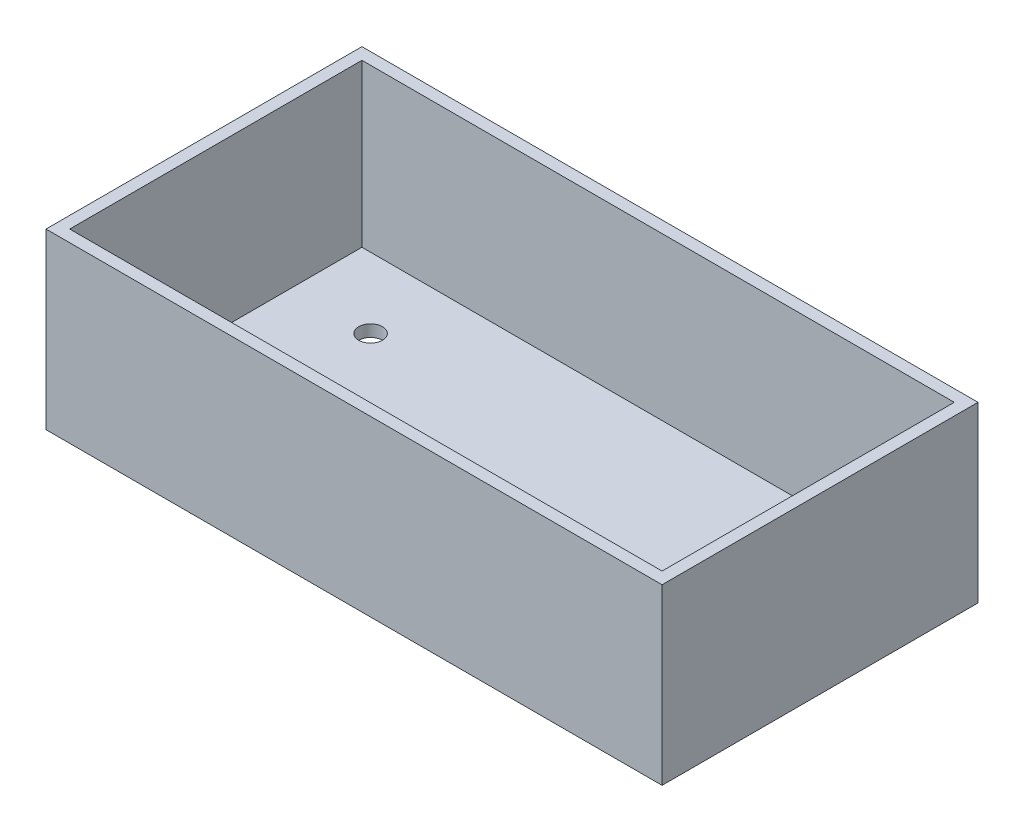
ISO-10303-21;
HEADER;
FILE_DESCRIPTION(('STEP AP214'),'2;1');
FILE_NAME('part.step','',(''),(''),'','','');
FILE_SCHEMA(('AUTOMOTIVE_DESIGN { 1 0 10303 214 1 1 1 1 }'));
ENDSEC;
DATA;
#1=APPLICATION_CONTEXT('core data for automotive mechanical design processes');
#2=APPLICATION_PROTOCOL_DEFINITION('international standard','automotive_design',2000,#1);
#3=PRODUCT_CONTEXT('',#1,'mechanical');
#4=PRODUCT('Part','Part','',(#3));
#5=PRODUCT_RELATED_PRODUCT_CATEGORY('part','',(#4));
#6=PRODUCT_DEFINITION_FORMATION('','',#4);
#7=PRODUCT_DEFINITION_CONTEXT('part definition',#1,'design');
#8=PRODUCT_DEFINITION('design','',#6,#7);
#9=PRODUCT_DEFINITION_SHAPE('','',#8);
#10=(LENGTH_UNIT() NAMED_UNIT(*) SI_UNIT(.MILLI.,.METRE.));
#11=(NAMED_UNIT(*) PLANE_ANGLE_UNIT() SI_UNIT($,.RADIAN.));
#12=(NAMED_UNIT(*) SI_UNIT($,.STERADIAN.) SOLID_ANGLE_UNIT());
#13=UNCERTAINTY_MEASURE_WITH_UNIT(LENGTH_MEASURE(1.E-05),#10,'distance_accuracy_value','');
#14=(GEOMETRIC_REPRESENTATION_CONTEXT(3) GLOBAL_UNCERTAINTY_ASSIGNED_CONTEXT((#13)) GLOBAL_UNIT_ASSIGNED_CONTEXT((#10,
#11,#12)) REPRESENTATION_CONTEXT('',''));
#15=CARTESIAN_POINT('',(0.,0.,0.));
#16=DIRECTION('',(0.,0.,1.));
#17=DIRECTION('',(1.,0.,0.));
#18=AXIS2_PLACEMENT_3D('',#15,#16,#17);
#19=CARTESIAN_POINT('',(0.,22.,0.));
#20=DIRECTION('',(0.,-1.,0.));
#21=DIRECTION('',(0.,0.,-1.));
#22=AXIS2_PLACEMENT_3D('',#19,#20,#21);
#23=PLANE('',#22);
#24=DIRECTION('',(0.,0.,-1.));
#25=VECTOR('',#24,1.);
#26=CARTESIAN_POINT('',(39.,22.,20.));
#27=LINE('',#26,#25);
#28=CARTESIAN_POINT('',(39.,22.,20.));
#29=VERTEX_POINT('',#28);
#30=CARTESIAN_POINT('',(39.,22.,-20.));
#31=VERTEX_POINT('',#30);
#32=EDGE_CURVE('E159',#29,#31,#27,.T.);
#33=ORIENTED_EDGE('',*,*,#32,.T.);
#34=DIRECTION('',(-1.,0.,0.));
#35=VECTOR('',#34,1.);
#36=CARTESIAN_POINT('',(-39.,22.,-20.));
#37=LINE('',#36,#35);
#38=CARTESIAN_POINT('',(-39.,22.,-20.));
#39=VERTEX_POINT('',#38);
#40=EDGE_CURVE('E94',#31,#39,#37,.T.);
#41=ORIENTED_EDGE('',*,*,#40,.T.);
#42=DIRECTION('',(0.,0.,1.));
#43=VECTOR('',#42,1.);
#44=CARTESIAN_POINT('',(-39.,22.,20.));
#45=LINE('',#44,#43);
#46=CARTESIAN_POINT('',(-39.,22.,20.));
#47=VERTEX_POINT('',#46);
#48=EDGE_CURVE('E164',#39,#47,#45,.T.);
#49=ORIENTED_EDGE('',*,*,#48,.T.);
#50=DIRECTION('',(1.,0.,0.));
#51=VECTOR('',#50,1.);
#52=CARTESIAN_POINT('',(-39.,22.,20.));
#53=LINE('',#52,#51);
#54=EDGE_CURVE('E66',#47,#29,#53,.T.);
#55=ORIENTED_EDGE('',*,*,#54,.T.);
#56=EDGE_LOOP('',(#33,#41,#49,#55));
#57=FACE_BOUND('',#56,.T.);
#58=DIRECTION('',(0.,0.,-1.));
#59=VECTOR('',#58,1.);
#60=CARTESIAN_POINT('',(37.5,22.,0.));
#61=LINE('',#60,#59);
#62=CARTESIAN_POINT('',(37.5,22.,18.5));
#63=VERTEX_POINT('',#62);
#64=CARTESIAN_POINT('',(37.5,22.,-18.5));
#65=VERTEX_POINT('',#64);
#66=EDGE_CURVE('E143',#63,#65,#61,.T.);
#67=ORIENTED_EDGE('',*,*,#66,.F.);
#68=DIRECTION('',(1.,0.,0.));
#69=VECTOR('',#68,1.);
#70=CARTESIAN_POINT('',(0.,22.,18.5));
#71=LINE('',#70,#69);
#72=CARTESIAN_POINT('',(-37.5,22.,18.5));
#73=VERTEX_POINT('',#72);
#74=EDGE_CURVE('E156',#73,#63,#71,.T.);
#75=ORIENTED_EDGE('',*,*,#74,.F.);
#76=DIRECTION('',(0.,0.,1.));
#77=VECTOR('',#76,1.);
#78=CARTESIAN_POINT('',(-37.5,22.,0.));
#79=LINE('',#78,#77);
#80=CARTESIAN_POINT('',(-37.5,22.,-18.5));
#81=VERTEX_POINT('',#80);
#82=EDGE_CURVE('E153',#81,#73,#79,.T.);
#83=ORIENTED_EDGE('',*,*,#82,.F.);
#84=DIRECTION('',(-1.,0.,0.));
#85=VECTOR('',#84,1.);
#86=CARTESIAN_POINT('',(0.,22.,-18.5));
#87=LINE('',#86,#85);
#88=EDGE_CURVE('E132',#65,#81,#87,.T.);
#89=ORIENTED_EDGE('',*,*,#88,.F.);
#90=EDGE_LOOP('',(#67,#75,#83,#89));
#91=FACE_BOUND('',#90,.T.);
#92=ADVANCED_FACE('F39',(#57,#91),#23,.F.);
#93=CARTESIAN_POINT('',(39.,22.,20.));
#94=DIRECTION('',(-1.,0.,0.));
#95=DIRECTION('',(0.,0.,1.));
#96=AXIS2_PLACEMENT_3D('',#93,#94,#95);
#97=PLANE('',#96);
#98=DIRECTION('',(0.,0.,-1.));
#99=VECTOR('',#98,1.);
#100=CARTESIAN_POINT('',(39.,0.,20.));
#101=LINE('',#100,#99);
#102=CARTESIAN_POINT('',(39.,0.,20.));
#103=VERTEX_POINT('',#102);
#104=CARTESIAN_POINT('',(39.,0.,-20.));
#105=VERTEX_POINT('',#104);
#106=EDGE_CURVE('E170',#103,#105,#101,.T.);
#107=ORIENTED_EDGE('',*,*,#106,.T.);
#108=DIRECTION('',(0.,-1.,0.));
#109=VECTOR('',#108,1.);
#110=CARTESIAN_POINT('',(39.,22.,-20.));
#111=LINE('',#110,#109);
#112=EDGE_CURVE('E11',#31,#105,#111,.T.);
#113=ORIENTED_EDGE('',*,*,#112,.F.);
#114=ORIENTED_EDGE('',*,*,#32,.F.);
#115=DIRECTION('',(0.,-1.,0.));
#116=VECTOR('',#115,1.);
#117=CARTESIAN_POINT('',(39.,22.,20.));
#118=LINE('',#117,#116);
#119=EDGE_CURVE('E169',#29,#103,#118,.T.);
#120=ORIENTED_EDGE('',*,*,#119,.T.);
#121=EDGE_LOOP('',(#107,#113,#114,#120));
#122=FACE_BOUND('',#121,.T.);
#123=ADVANCED_FACE('F41',(#122),#97,.F.);
#124=CARTESIAN_POINT('',(-39.,22.,-20.));
#125=DIRECTION('',(0.,0.,1.));
#126=DIRECTION('',(1.,0.,0.));
#127=AXIS2_PLACEMENT_3D('',#124,#125,#126);
#128=PLANE('',#127);
#129=DIRECTION('',(-1.,0.,0.));
#130=VECTOR('',#129,1.);
#131=CARTESIAN_POINT('',(-39.,0.,-20.));
#132=LINE('',#131,#130);
#133=CARTESIAN_POINT('',(-39.,0.,-20.));
#134=VERTEX_POINT('',#133);
#135=EDGE_CURVE('E174',#105,#134,#132,.T.);
#136=ORIENTED_EDGE('',*,*,#135,.T.);
#137=DIRECTION('',(0.,-1.,0.));
#138=VECTOR('',#137,1.);
#139=CARTESIAN_POINT('',(-39.,22.,-20.));
#140=LINE('',#139,#138);
#141=EDGE_CURVE('E49',#39,#134,#140,.T.);
#142=ORIENTED_EDGE('',*,*,#141,.F.);
#143=ORIENTED_EDGE('',*,*,#40,.F.);
#144=ORIENTED_EDGE('',*,*,#112,.T.);
#145=EDGE_LOOP('',(#136,#142,#143,#144));
#146=FACE_BOUND('',#145,.T.);
#147=ADVANCED_FACE('F228',(#146),#128,.F.);
#148=CARTESIAN_POINT('',(-39.,22.,20.));
#149=DIRECTION('',(1.,0.,0.));
#150=DIRECTION('',(0.,0.,-1.));
#151=AXIS2_PLACEMENT_3D('',#148,#149,#150);
#152=PLANE('',#151);
#153=DIRECTION('',(0.,0.,1.));
#154=VECTOR('',#153,1.);
#155=CARTESIAN_POINT('',(-39.,0.,20.));
#156=LINE('',#155,#154);
#157=CARTESIAN_POINT('',(-39.,0.,20.));
#158=VERTEX_POINT('',#157);
#159=EDGE_CURVE('E177',#134,#158,#156,.T.);
#160=ORIENTED_EDGE('',*,*,#159,.T.);
#161=DIRECTION('',(0.,-1.,0.));
#162=VECTOR('',#161,1.);
#163=CARTESIAN_POINT('',(-39.,22.,20.));
#164=LINE('',#163,#162);
#165=EDGE_CURVE('E184',#47,#158,#164,.T.);
#166=ORIENTED_EDGE('',*,*,#165,.F.);
#167=ORIENTED_EDGE('',*,*,#48,.F.);
#168=ORIENTED_EDGE('',*,*,#141,.T.);
#169=EDGE_LOOP('',(#160,#166,#167,#168));
#170=FACE_BOUND('',#169,.T.);
#171=ADVANCED_FACE('F240',(#170),#152,.F.);
#172=CARTESIAN_POINT('',(-39.,22.,20.));
#173=DIRECTION('',(0.,0.,-1.));
#174=DIRECTION('',(-1.,0.,0.));
#175=AXIS2_PLACEMENT_3D('',#172,#173,#174);
#176=PLANE('',#175);
#177=DIRECTION('',(1.,0.,0.));
#178=VECTOR('',#177,1.);
#179=CARTESIAN_POINT('',(-39.,0.,20.));
#180=LINE('',#179,#178);
#181=EDGE_CURVE('E87',#158,#103,#180,.T.);
#182=ORIENTED_EDGE('',*,*,#181,.T.);
#183=ORIENTED_EDGE('',*,*,#119,.F.);
#184=ORIENTED_EDGE('',*,*,#54,.F.);
#185=ORIENTED_EDGE('',*,*,#165,.T.);
#186=EDGE_LOOP('',(#182,#183,#184,#185));
#187=FACE_BOUND('',#186,.T.);
#188=ADVANCED_FACE('F236',(#187),#176,.F.);
#189=CARTESIAN_POINT('',(0.,0.,0.));
#190=DIRECTION('',(0.,-1.,0.));
#191=DIRECTION('',(0.,0.,-1.));
#192=AXIS2_PLACEMENT_3D('',#189,#190,#191);
#193=PLANE('',#192);
#194=CARTESIAN_POINT('',(-27.5,0.,9.59999999999999));
#195=DIRECTION('',(0.,-1.,0.));
#196=DIRECTION('',(0.,0.,-1.));
#197=AXIS2_PLACEMENT_3D('',#194,#195,#196);
#198=CIRCLE('',#197,1.5);
#199=CARTESIAN_POINT('',(-27.5,0.,8.09999999999999));
#200=VERTEX_POINT('',#199);
#201=EDGE_CURVE('E366',#200,#200,#198,.T.);
#202=ORIENTED_EDGE('',*,*,#201,.F.);
#203=EDGE_LOOP('',(#202));
#204=FACE_BOUND('',#203,.T.);
#205=CARTESIAN_POINT('',(-27.5,0.,-9.6));
#206=DIRECTION('',(0.,-1.,0.));
#207=DIRECTION('',(0.,0.,-1.));
#208=AXIS2_PLACEMENT_3D('',#205,#206,#207);
#209=CIRCLE('',#208,1.5);
#210=CARTESIAN_POINT('',(-27.5,0.,-11.1));
#211=VERTEX_POINT('',#210);
#212=EDGE_CURVE('E368',#211,#211,#209,.T.);
#213=ORIENTED_EDGE('',*,*,#212,.F.);
#214=EDGE_LOOP('',(#213));
#215=FACE_BOUND('',#214,.T.);
#216=CARTESIAN_POINT('',(27.5,0.,-9.6));
#217=DIRECTION('',(0.,-1.,0.));
#218=DIRECTION('',(0.,0.,-1.));
#219=AXIS2_PLACEMENT_3D('',#216,#217,#218);
#220=CIRCLE('',#219,1.5);
#221=CARTESIAN_POINT('',(27.5,0.,-11.1));
#222=VERTEX_POINT('',#221);
#223=EDGE_CURVE('E371',#222,#222,#220,.T.);
#224=ORIENTED_EDGE('',*,*,#223,.F.);
#225=EDGE_LOOP('',(#224));
#226=FACE_BOUND('',#225,.T.);
#227=CARTESIAN_POINT('',(27.5,0.,9.6));
#228=DIRECTION('',(0.,-1.,0.));
#229=DIRECTION('',(0.,0.,-1.));
#230=AXIS2_PLACEMENT_3D('',#227,#228,#229);
#231=CIRCLE('',#230,1.5);
#232=CARTESIAN_POINT('',(27.5,0.,8.1));
#233=VERTEX_POINT('',#232);
#234=EDGE_CURVE('E195',#233,#233,#231,.T.);
#235=ORIENTED_EDGE('',*,*,#234,.F.);
#236=EDGE_LOOP('',(#235));
#237=FACE_BOUND('',#236,.T.);
#238=ORIENTED_EDGE('',*,*,#106,.F.);
#239=ORIENTED_EDGE('',*,*,#181,.F.);
#240=ORIENTED_EDGE('',*,*,#159,.F.);
#241=ORIENTED_EDGE('',*,*,#135,.F.);
#242=EDGE_LOOP('',(#238,#239,#240,#241));
#243=FACE_BOUND('',#242,.T.);
#244=ADVANCED_FACE('F233',(#204,#215,#226,#237,#243),#193,.T.);
#245=CARTESIAN_POINT('',(37.5,22.,20.));
#246=DIRECTION('',(-1.,0.,0.));
#247=DIRECTION('',(0.,0.,1.));
#248=AXIS2_PLACEMENT_3D('',#245,#246,#247);
#249=PLANE('',#248);
#250=DIRECTION('',(0.,0.,-1.));
#251=VECTOR('',#250,1.);
#252=CARTESIAN_POINT('',(37.5,1.5,0.));
#253=LINE('',#252,#251);
#254=CARTESIAN_POINT('',(37.5,1.5,18.5));
#255=VERTEX_POINT('',#254);
#256=CARTESIAN_POINT('',(37.5,1.5,-18.5));
#257=VERTEX_POINT('',#256);
#258=EDGE_CURVE('E122',#255,#257,#253,.T.);
#259=ORIENTED_EDGE('',*,*,#258,.F.);
#260=DIRECTION('',(0.,-1.,0.));
#261=VECTOR('',#260,1.);
#262=CARTESIAN_POINT('',(37.5,22.,18.5));
#263=LINE('',#262,#261);
#264=EDGE_CURVE('E147',#63,#255,#263,.T.);
#265=ORIENTED_EDGE('',*,*,#264,.F.);
#266=ORIENTED_EDGE('',*,*,#66,.T.);
#267=DIRECTION('',(0.,-1.,0.));
#268=VECTOR('',#267,1.);
#269=CARTESIAN_POINT('',(37.5,22.,-18.5));
#270=LINE('',#269,#268);
#271=EDGE_CURVE('E136',#65,#257,#270,.T.);
#272=ORIENTED_EDGE('',*,*,#271,.T.);
#273=EDGE_LOOP('',(#259,#265,#266,#272));
#274=FACE_BOUND('',#273,.T.);
#275=ADVANCED_FACE('F221',(#274),#249,.T.);
#276=CARTESIAN_POINT('',(-39.,22.,-18.5));
#277=DIRECTION('',(0.,0.,1.));
#278=DIRECTION('',(1.,0.,0.));
#279=AXIS2_PLACEMENT_3D('',#276,#277,#278);
#280=PLANE('',#279);
#281=DIRECTION('',(-1.,0.,0.));
#282=VECTOR('',#281,1.);
#283=CARTESIAN_POINT('',(0.,1.5,-18.5));
#284=LINE('',#283,#282);
#285=CARTESIAN_POINT('',(-37.5,1.5,-18.5));
#286=VERTEX_POINT('',#285);
#287=EDGE_CURVE('E116',#257,#286,#284,.T.);
#288=ORIENTED_EDGE('',*,*,#287,.F.);
#289=ORIENTED_EDGE('',*,*,#271,.F.);
#290=ORIENTED_EDGE('',*,*,#88,.T.);
#291=DIRECTION('',(0.,-1.,0.));
#292=VECTOR('',#291,1.);
#293=CARTESIAN_POINT('',(-37.5,22.,-18.5));
#294=LINE('',#293,#292);
#295=EDGE_CURVE('E129',#81,#286,#294,.T.);
#296=ORIENTED_EDGE('',*,*,#295,.T.);
#297=EDGE_LOOP('',(#288,#289,#290,#296));
#298=FACE_BOUND('',#297,.T.);
#299=ADVANCED_FACE('F130',(#298),#280,.T.);
#300=CARTESIAN_POINT('',(-37.5,22.,20.));
#301=DIRECTION('',(1.,0.,0.));
#302=DIRECTION('',(0.,0.,-1.));
#303=AXIS2_PLACEMENT_3D('',#300,#301,#302);
#304=PLANE('',#303);
#305=DIRECTION('',(0.,0.,1.));
#306=VECTOR('',#305,1.);
#307=CARTESIAN_POINT('',(-37.5,1.5,0.));
#308=LINE('',#307,#306);
#309=CARTESIAN_POINT('',(-37.5,1.5,18.5));
#310=VERTEX_POINT('',#309);
#311=EDGE_CURVE('E120',#286,#310,#308,.T.);
#312=ORIENTED_EDGE('',*,*,#311,.F.);
#313=ORIENTED_EDGE('',*,*,#295,.F.);
#314=ORIENTED_EDGE('',*,*,#82,.T.);
#315=DIRECTION('',(0.,-1.,0.));
#316=VECTOR('',#315,1.);
#317=CARTESIAN_POINT('',(-37.5,22.,18.5));
#318=LINE('',#317,#316);
#319=EDGE_CURVE('E57',#73,#310,#318,.T.);
#320=ORIENTED_EDGE('',*,*,#319,.T.);
#321=EDGE_LOOP('',(#312,#313,#314,#320));
#322=FACE_BOUND('',#321,.T.);
#323=ADVANCED_FACE('F138',(#322),#304,.T.);
#324=CARTESIAN_POINT('',(-39.,22.,18.5));
#325=DIRECTION('',(0.,0.,-1.));
#326=DIRECTION('',(-1.,0.,0.));
#327=AXIS2_PLACEMENT_3D('',#324,#325,#326);
#328=PLANE('',#327);
#329=DIRECTION('',(1.,0.,0.));
#330=VECTOR('',#329,1.);
#331=CARTESIAN_POINT('',(0.,1.5,18.5));
#332=LINE('',#331,#330);
#333=EDGE_CURVE('E140',#310,#255,#332,.T.);
#334=ORIENTED_EDGE('',*,*,#333,.F.);
#335=ORIENTED_EDGE('',*,*,#319,.F.);
#336=ORIENTED_EDGE('',*,*,#74,.T.);
#337=ORIENTED_EDGE('',*,*,#264,.T.);
#338=EDGE_LOOP('',(#334,#335,#336,#337));
#339=FACE_BOUND('',#338,.T.);
#340=ADVANCED_FACE('F217',(#339),#328,.T.);
#341=CARTESIAN_POINT('',(0.,1.5,0.));
#342=DIRECTION('',(0.,-1.,0.));
#343=DIRECTION('',(0.,0.,-1.));
#344=AXIS2_PLACEMENT_3D('',#341,#342,#343);
#345=PLANE('',#344);
#346=CARTESIAN_POINT('',(-27.5,1.5,9.59999999999999));
#347=DIRECTION('',(0.,-1.,0.));
#348=DIRECTION('',(0.,0.,-1.));
#349=AXIS2_PLACEMENT_3D('',#346,#347,#348);
#350=CIRCLE('',#349,1.5);
#351=CARTESIAN_POINT('',(-27.5,1.5,8.09999999999999));
#352=VERTEX_POINT('',#351);
#353=EDGE_CURVE('E43',#352,#352,#350,.T.);
#354=ORIENTED_EDGE('',*,*,#353,.T.);
#355=EDGE_LOOP('',(#354));
#356=FACE_BOUND('',#355,.T.);
#357=CARTESIAN_POINT('',(-27.5,1.5,-9.6));
#358=DIRECTION('',(0.,-1.,0.));
#359=DIRECTION('',(0.,0.,-1.));
#360=AXIS2_PLACEMENT_3D('',#357,#358,#359);
#361=CIRCLE('',#360,1.5);
#362=CARTESIAN_POINT('',(-27.5,1.5,-11.1));
#363=VERTEX_POINT('',#362);
#364=EDGE_CURVE('E198',#363,#363,#361,.T.);
#365=ORIENTED_EDGE('',*,*,#364,.T.);
#366=EDGE_LOOP('',(#365));
#367=FACE_BOUND('',#366,.T.);
#368=CARTESIAN_POINT('',(27.5,1.5,-9.6));
#369=DIRECTION('',(0.,-1.,0.));
#370=DIRECTION('',(0.,0.,-1.));
#371=AXIS2_PLACEMENT_3D('',#368,#369,#370);
#372=CIRCLE('',#371,1.5);
#373=CARTESIAN_POINT('',(27.5,1.5,-11.1));
#374=VERTEX_POINT('',#373);
#375=EDGE_CURVE('E194',#374,#374,#372,.T.);
#376=ORIENTED_EDGE('',*,*,#375,.T.);
#377=EDGE_LOOP('',(#376));
#378=FACE_BOUND('',#377,.T.);
#379=CARTESIAN_POINT('',(27.5,1.5,9.6));
#380=DIRECTION('',(0.,-1.,0.));
#381=DIRECTION('',(0.,0.,-1.));
#382=AXIS2_PLACEMENT_3D('',#379,#380,#381);
#383=CIRCLE('',#382,1.5);
#384=CARTESIAN_POINT('',(27.5,1.5,8.1));
#385=VERTEX_POINT('',#384);
#386=EDGE_CURVE('E190',#385,#385,#383,.T.);
#387=ORIENTED_EDGE('',*,*,#386,.T.);
#388=EDGE_LOOP('',(#387));
#389=FACE_BOUND('',#388,.T.);
#390=ORIENTED_EDGE('',*,*,#258,.T.);
#391=ORIENTED_EDGE('',*,*,#287,.T.);
#392=ORIENTED_EDGE('',*,*,#311,.T.);
#393=ORIENTED_EDGE('',*,*,#333,.T.);
#394=EDGE_LOOP('',(#390,#391,#392,#393));
#395=FACE_BOUND('',#394,.T.);
#396=ADVANCED_FACE('F118',(#356,#367,#378,#389,#395),#345,.F.);
#397=CARTESIAN_POINT('',(27.5,22.,9.6));
#398=DIRECTION('',(0.,-1.,0.));
#399=DIRECTION('',(0.,0.,-1.));
#400=AXIS2_PLACEMENT_3D('',#397,#398,#399);
#401=CYLINDRICAL_SURFACE('',#400,1.5);
#402=ORIENTED_EDGE('',*,*,#234,.T.);
#403=EDGE_LOOP('',(#402));
#404=FACE_BOUND('',#403,.T.);
#405=ORIENTED_EDGE('',*,*,#386,.F.);
#406=EDGE_LOOP('',(#405));
#407=FACE_BOUND('',#406,.T.);
#408=ADVANCED_FACE('F296',(#404,#407),#401,.F.);
#409=CARTESIAN_POINT('',(27.5,22.,-9.6));
#410=DIRECTION('',(0.,-1.,0.));
#411=DIRECTION('',(0.,0.,-1.));
#412=AXIS2_PLACEMENT_3D('',#409,#410,#411);
#413=CYLINDRICAL_SURFACE('',#412,1.5);
#414=ORIENTED_EDGE('',*,*,#223,.T.);
#415=EDGE_LOOP('',(#414));
#416=FACE_BOUND('',#415,.T.);
#417=ORIENTED_EDGE('',*,*,#375,.F.);
#418=EDGE_LOOP('',(#417));
#419=FACE_BOUND('',#418,.T.);
#420=ADVANCED_FACE('F302',(#416,#419),#413,.F.);
#421=CARTESIAN_POINT('',(-27.5,22.,-9.6));
#422=DIRECTION('',(0.,-1.,0.));
#423=DIRECTION('',(0.,0.,-1.));
#424=AXIS2_PLACEMENT_3D('',#421,#422,#423);
#425=CYLINDRICAL_SURFACE('',#424,1.5);
#426=ORIENTED_EDGE('',*,*,#212,.T.);
#427=EDGE_LOOP('',(#426));
#428=FACE_BOUND('',#427,.T.);
#429=ORIENTED_EDGE('',*,*,#364,.F.);
#430=EDGE_LOOP('',(#429));
#431=FACE_BOUND('',#430,.T.);
#432=ADVANCED_FACE('F310',(#428,#431),#425,.F.);
#433=CARTESIAN_POINT('',(-27.5,22.,9.59999999999999));
#434=DIRECTION('',(0.,-1.,0.));
#435=DIRECTION('',(0.,0.,-1.));
#436=AXIS2_PLACEMENT_3D('',#433,#434,#435);
#437=CYLINDRICAL_SURFACE('',#436,1.5);
#438=ORIENTED_EDGE('',*,*,#201,.T.);
#439=EDGE_LOOP('',(#438));
#440=FACE_BOUND('',#439,.T.);
#441=ORIENTED_EDGE('',*,*,#353,.F.);
#442=EDGE_LOOP('',(#441));
#443=FACE_BOUND('',#442,.T.);
#444=ADVANCED_FACE('F318',(#440,#443),#437,.F.);
#445=CLOSED_SHELL('',(#92,#123,#147,#171,#188,#244,#275,#299,#323,#340,#396,#408,#420,#432,#444));
#446=MANIFOLD_SOLID_BREP('B2',#445);
#447=ADVANCED_BREP_SHAPE_REPRESENTATION('',(#18,#446),#14);
#448=SHAPE_DEFINITION_REPRESENTATION(#9,#447);
ENDSEC;
END-ISO-10303-21;
